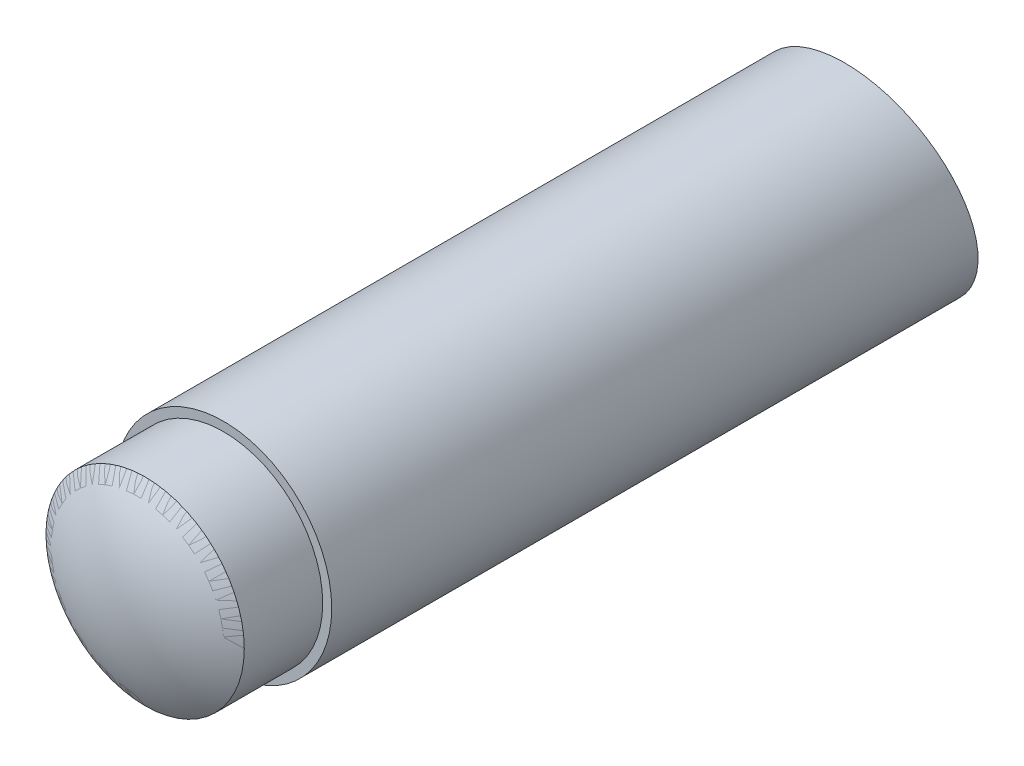
ISO-10303-21;
HEADER;
FILE_DESCRIPTION(('STEP AP214'),'2;1');
FILE_NAME('part.step','',(''),(''),'','','');
FILE_SCHEMA(('AUTOMOTIVE_DESIGN { 1 0 10303 214 1 1 1 1 }'));
ENDSEC;
DATA;
#1=APPLICATION_CONTEXT('core data for automotive mechanical design processes');
#2=APPLICATION_PROTOCOL_DEFINITION('international standard','automotive_design',2000,#1);
#3=PRODUCT_CONTEXT('',#1,'mechanical');
#4=PRODUCT('Part','Part','',(#3));
#5=PRODUCT_RELATED_PRODUCT_CATEGORY('part','',(#4));
#6=PRODUCT_DEFINITION_FORMATION('','',#4);
#7=PRODUCT_DEFINITION_CONTEXT('part definition',#1,'design');
#8=PRODUCT_DEFINITION('design','',#6,#7);
#9=PRODUCT_DEFINITION_SHAPE('','',#8);
#10=(LENGTH_UNIT() NAMED_UNIT(*) SI_UNIT(.MILLI.,.METRE.));
#11=(NAMED_UNIT(*) PLANE_ANGLE_UNIT() SI_UNIT($,.RADIAN.));
#12=(NAMED_UNIT(*) SI_UNIT($,.STERADIAN.) SOLID_ANGLE_UNIT());
#13=UNCERTAINTY_MEASURE_WITH_UNIT(LENGTH_MEASURE(1.E-05),#10,'distance_accuracy_value','');
#14=(GEOMETRIC_REPRESENTATION_CONTEXT(3) GLOBAL_UNCERTAINTY_ASSIGNED_CONTEXT((#13)) GLOBAL_UNIT_ASSIGNED_CONTEXT((#10,
#11,#12)) REPRESENTATION_CONTEXT('',''));
#15=CARTESIAN_POINT('',(0.,0.,0.));
#16=DIRECTION('',(0.,0.,1.));
#17=DIRECTION('',(1.,0.,0.));
#18=AXIS2_PLACEMENT_3D('',#15,#16,#17);
#19=CARTESIAN_POINT('',(0.,0.,33.));
#20=DIRECTION('',(0.,0.,1.));
#21=DIRECTION('',(0.,-1.,0.));
#22=AXIS2_PLACEMENT_3D('',#19,#20,#21);
#23=SPHERICAL_SURFACE('',#22,10.);
#24=CARTESIAN_POINT('',(0.,0.,41.351646544245));
#25=DIRECTION('',(0.,0.,1.));
#26=DIRECTION('',(1.,0.,0.));
#27=AXIS2_PLACEMENT_3D('',#24,#25,#26);
#28=CIRCLE('',#27,5.5);
#29=CARTESIAN_POINT('',(5.5,0.,41.351646544245));
#30=VERTEX_POINT('',#29);
#31=EDGE_CURVE('E12',#30,#30,#28,.T.);
#32=ORIENTED_EDGE('',*,*,#31,.T.);
#33=EDGE_LOOP('',(#32));
#34=FACE_BOUND('',#33,.T.);
#35=ADVANCED_FACE('F52',(#34),#23,.T.);
#36=OPEN_SHELL('',(#35));
#37=SHELL_BASED_SURFACE_MODEL('B2',(#36));
#38=CARTESIAN_POINT('',(0.,0.,43.));
#39=DIRECTION('',(0.,0.,-1.));
#40=DIRECTION('',(-1.,0.,0.));
#41=AXIS2_PLACEMENT_3D('',#38,#39,#40);
#42=CYLINDRICAL_SURFACE('',#41,6.);
#43=DIRECTION('',(0.,0.,-1.));
#44=VECTOR('',#43,1.);
#45=CARTESIAN_POINT('',(-5.45435605731786,2.5,43.));
#46=LINE('',#45,#44);
#47=CARTESIAN_POINT('',(-5.45435605731786,2.5,15.));
#48=VERTEX_POINT('',#47);
#49=CARTESIAN_POINT('',(-5.45435605731786,2.5,23.));
#50=VERTEX_POINT('',#49);
#51=EDGE_CURVE('E50',#48,#50,#46,.F.);
#52=ORIENTED_EDGE('',*,*,#51,.T.);
#53=CARTESIAN_POINT('',(-5.45435605731786,2.5,23.));
#54=CARTESIAN_POINT('',(-5.4543414367274,2.50001024965806,23.066990421397));
#55=CARTESIAN_POINT('',(-5.45558986423115,2.49730766074456,23.1339728576071));
#56=CARTESIAN_POINT('',(-5.46050344433192,2.48655699342007,23.267391217606));
#57=CARTESIAN_POINT('',(-5.46416759753227,2.47851112553775,23.3338273558978));
#58=CARTESIAN_POINT('',(-5.47378318611766,2.45719882557102,23.4654018598714));
#59=CARTESIAN_POINT('',(-5.47972494833872,2.44395446621823,23.5305445048847));
#60=CARTESIAN_POINT('',(-5.49369035165668,2.41239773056354,23.6593476505706));
#61=CARTESIAN_POINT('',(-5.50171413528084,2.39408500729503,23.7230080494492));
#62=CARTESIAN_POINT('',(-5.52852216859036,2.33184505253746,23.9109704766892));
#63=CARTESIAN_POINT('',(-5.55006534458072,2.28056973965756,24.0325349409199));
#64=CARTESIAN_POINT('',(-5.5980502687434,2.16009667726577,24.265394969978));
#65=CARTESIAN_POINT('',(-5.62449711638193,2.09088024017802,24.3766796624162));
#66=CARTESIAN_POINT('',(-5.68111739532849,1.93194216605246,24.5926555180297));
#67=CARTESIAN_POINT('',(-5.71141645652258,1.84129131772596,24.6966314637585));
#68=CARTESIAN_POINT('',(-5.77129106659512,1.6440247325164,24.8884169369691));
#69=CARTESIAN_POINT('',(-5.80086645933831,1.53740558511415,24.9762230019235));
#70=CARTESIAN_POINT('',(-5.85751079611205,1.30552662419109,25.1368988289762));
#71=CARTESIAN_POINT('',(-5.88441492036275,1.17965801419142,25.2089534877025));
#72=CARTESIAN_POINT('',(-5.93113050419022,0.916263349803655,25.3305523948046));
#73=CARTESIAN_POINT('',(-5.95094514533806,0.778742558960748,25.3801067434128));
#74=CARTESIAN_POINT('',(-5.98035028996094,0.503538212911763,25.4526785710471));
#75=CARTESIAN_POINT('',(-5.99041924152298,0.36623563668335,25.4769429460133));
#76=CARTESIAN_POINT('',(-6.00093656296527,0.0891608856613059,25.502275267891));
#77=CARTESIAN_POINT('',(-6.00138866214753,-0.0506103107853714,25.5033522066188));
#78=CARTESIAN_POINT('',(-5.99290254661357,-0.319586702683726,25.4829313516378));
#79=CARTESIAN_POINT('',(-5.98453414521297,-0.448917245472146,25.4628034512649));
#80=CARTESIAN_POINT('',(-5.96013005449445,-0.702167963543973,25.4028930910878));
#81=CARTESIAN_POINT('',(-5.94409393401055,-0.82608783415044,25.3631095260154));
#82=CARTESIAN_POINT('',(-5.90559715444489,-1.06727556823007,25.2645442163381));
#83=CARTESIAN_POINT('',(-5.88304219015531,-1.1844130633202,25.2054818206956));
#84=CARTESIAN_POINT('',(-5.83371457161593,-1.40742238732224,25.0703092180309));
#85=CARTESIAN_POINT('',(-5.80694038196896,-1.51329009151026,24.9941928006955));
#86=CARTESIAN_POINT('',(-5.74963576527152,-1.71867537807254,24.8208409664575));
#87=CARTESIAN_POINT('',(-5.71897359653013,-1.81722082953265,24.7224958287417));
#88=CARTESIAN_POINT('',(-5.65876079183101,-1.99685313522822,24.5105893535751));
#89=CARTESIAN_POINT('',(-5.62921072584973,-2.07793113494236,24.3970203460054));
#90=CARTESIAN_POINT('',(-5.57361619012468,-2.22284514508404,24.1531453498455));
#91=CARTESIAN_POINT('',(-5.54772171984214,-2.28601504206341,24.0224071265261));
#92=CARTESIAN_POINT('',(-5.50417661447929,-2.38897619183128,23.7508546265431));
#93=CARTESIAN_POINT('',(-5.48651080537515,-2.4288105117282,23.6100594530022));
#94=CARTESIAN_POINT('',(-5.46773287951056,-2.47065526537902,23.3898491565922));
#95=CARTESIAN_POINT('',(-5.46274303006064,-2.48164099212926,23.3123689332134));
#96=CARTESIAN_POINT('',(-5.45604541462647,-2.49631631258703,23.1566098186605));
#97=CARTESIAN_POINT('',(-5.45433647659977,-2.50000851178052,23.0783312227393));
#98=CARTESIAN_POINT('',(-5.45435605731786,-2.5,23.));
#99=B_SPLINE_CURVE_WITH_KNOTS('',3,(#53,#54,#55,#56,#57,#58,#59,#60,#61,#62,#63,#64,#65,#66,#67,
#68,#69,#70,#71,#72,#73,#74,#75,#76,#77,#78,#79,#80,#81,#82,#83,#84,#85,#86,#87,#88,#89,#90,#91,
#92,#93,#94,#95,#96,#97,#98),.UNSPECIFIED.,.F.,.F.,(4,2,2,2,2,2,2,2,2,2,2,2,2,2,2,2,2,2,2,2,2,2,
4),(0.,0.200891876435008,0.401700695097973,0.601665948391963,0.801644894158599,1.20075599352941,
1.6002844916061,2.02212344548655,2.44405262481498,2.88432120276327,3.32439195134774,
3.74155898035476,4.15856423395471,4.55019084443641,4.94183947919071,5.33946474085078,
5.73723503589979,6.16301556467703,6.58901142297274,7.02923147484728,7.4686364954648,
7.70350874445824,7.93829707423865),.UNSPECIFIED.);
#100=CARTESIAN_POINT('',(-5.45435605731786,-2.5,23.));
#101=VERTEX_POINT('',#100);
#102=EDGE_CURVE('E82',#50,#101,#99,.T.);
#103=ORIENTED_EDGE('',*,*,#102,.T.);
#104=DIRECTION('',(0.,0.,-1.));
#105=VECTOR('',#104,1.);
#106=CARTESIAN_POINT('',(-5.45435605731786,-2.5,43.));
#107=LINE('',#106,#105);
#108=CARTESIAN_POINT('',(-5.45435605731786,-2.5,15.));
#109=VERTEX_POINT('',#108);
#110=EDGE_CURVE('E154',#101,#109,#107,.T.);
#111=ORIENTED_EDGE('',*,*,#110,.T.);
#112=CARTESIAN_POINT('',(-5.45435605731786,-2.5,15.));
#113=CARTESIAN_POINT('',(-5.4543414367274,-2.50001024965806,14.933009578603));
#114=CARTESIAN_POINT('',(-5.45558986423115,-2.49730766074456,14.8660271423929));
#115=CARTESIAN_POINT('',(-5.46050344433192,-2.48655699342007,14.732608782394));
#116=CARTESIAN_POINT('',(-5.46416759753227,-2.47851112553775,14.6661726441022));
#117=CARTESIAN_POINT('',(-5.47378318611766,-2.45719882557102,14.5345981401286));
#118=CARTESIAN_POINT('',(-5.47972494833872,-2.44395446621823,14.4694554951153));
#119=CARTESIAN_POINT('',(-5.49369035165668,-2.41239773056354,14.3406523494294));
#120=CARTESIAN_POINT('',(-5.50171413528084,-2.39408500729503,14.2769919505508));
#121=CARTESIAN_POINT('',(-5.52852216859036,-2.33184505253746,14.0890295233108));
#122=CARTESIAN_POINT('',(-5.55006534458072,-2.28056973965756,13.9674650590801));
#123=CARTESIAN_POINT('',(-5.5980502687434,-2.16009667726576,13.734605030022));
#124=CARTESIAN_POINT('',(-5.62449711638193,-2.09088024017802,13.6233203375838));
#125=CARTESIAN_POINT('',(-5.68111739532849,-1.93194216605246,13.4073444819703));
#126=CARTESIAN_POINT('',(-5.71141645652258,-1.84129131772596,13.3033685362414));
#127=CARTESIAN_POINT('',(-5.77129106659512,-1.6440247325164,13.1115830630309));
#128=CARTESIAN_POINT('',(-5.80086645933831,-1.53740558511415,13.0237769980765));
#129=CARTESIAN_POINT('',(-5.85751079611205,-1.30552662419109,12.8631011710238));
#130=CARTESIAN_POINT('',(-5.88441492036275,-1.17965801419141,12.7910465122975));
#131=CARTESIAN_POINT('',(-5.93113050419022,-0.916263349803653,12.6694476051954));
#132=CARTESIAN_POINT('',(-5.95094514533806,-0.778742558960746,12.6198932565872));
#133=CARTESIAN_POINT('',(-5.98035028996094,-0.503538212911761,12.5473214289529));
#134=CARTESIAN_POINT('',(-5.99041924152298,-0.366235636683348,12.5230570539867));
#135=CARTESIAN_POINT('',(-6.00093656296527,-0.0891608856613045,12.497724732109));
#136=CARTESIAN_POINT('',(-6.00138866214753,0.0506103107853725,12.4966477933812));
#137=CARTESIAN_POINT('',(-5.99290254661357,0.319586702683727,12.5170686483622));
#138=CARTESIAN_POINT('',(-5.98453414521297,0.448917245472146,12.5371965487351));
#139=CARTESIAN_POINT('',(-5.96013005449445,0.702167963543973,12.5971069089122));
#140=CARTESIAN_POINT('',(-5.94409393401055,0.826087834150441,12.6368904739846));
#141=CARTESIAN_POINT('',(-5.90559715444489,1.06727556823007,12.7354557836619));
#142=CARTESIAN_POINT('',(-5.88304219015531,1.1844130633202,12.7945181793044));
#143=CARTESIAN_POINT('',(-5.83371457161593,1.40742238732224,12.9296907819691));
#144=CARTESIAN_POINT('',(-5.80694038196897,1.51329009151026,13.0058071993045));
#145=CARTESIAN_POINT('',(-5.74963576527152,1.71867537807254,13.1791590335425));
#146=CARTESIAN_POINT('',(-5.71897359653013,1.81722082953265,13.2775041712583));
#147=CARTESIAN_POINT('',(-5.65876079183101,1.99685313522822,13.4894106464249));
#148=CARTESIAN_POINT('',(-5.62921072584973,2.07793113494236,13.6029796539946));
#149=CARTESIAN_POINT('',(-5.57361619012467,2.22284514508405,13.8468546501545));
#150=CARTESIAN_POINT('',(-5.54772171984214,2.28601504206341,13.9775928734739));
#151=CARTESIAN_POINT('',(-5.50417661447929,2.38897619183128,14.2491453734569));
#152=CARTESIAN_POINT('',(-5.48651080537515,2.4288105117282,14.3899405469978));
#153=CARTESIAN_POINT('',(-5.46773287951056,2.47065526537902,14.6101508434078));
#154=CARTESIAN_POINT('',(-5.46274303006064,2.48164099212926,14.6876310667866));
#155=CARTESIAN_POINT('',(-5.45604541462647,2.49631631258703,14.8433901813395));
#156=CARTESIAN_POINT('',(-5.45433647659977,2.50000851178052,14.9216687772607));
#157=CARTESIAN_POINT('',(-5.45435605731786,2.5,15.));
#158=B_SPLINE_CURVE_WITH_KNOTS('',3,(#112,#113,#114,#115,#116,#117,#118,#119,#120,#121,#122,
#123,#124,#125,#126,#127,#128,#129,#130,#131,#132,#133,#134,#135,#136,#137,#138,#139,#140,#141,
#142,#143,#144,#145,#146,#147,#148,#149,#150,#151,#152,#153,#154,#155,#156,#157),.UNSPECIFIED.,
.F.,.F.,(4,2,2,2,2,2,2,2,2,2,2,2,2,2,2,2,2,2,2,2,2,2,4),(0.,0.200891876435008,0.401700695097975,
0.601665948391965,0.801644894158599,1.20075599352942,1.6002844916061,2.02212344548655,
2.44405262481498,2.88432120276328,3.32439195134774,3.74155898035476,4.15856423395471,
4.55019084443641,4.94183947919071,5.33946474085078,5.73723503589979,6.16301556467703,
6.58901142297275,7.02923147484728,7.4686364954648,7.70350874445824,7.93829707423865),.UNSPECIFIED.);
#159=EDGE_CURVE('E75',#109,#48,#158,.T.);
#160=ORIENTED_EDGE('',*,*,#159,.T.);
#161=EDGE_LOOP('',(#52,#103,#111,#160));
#162=FACE_BOUND('',#161,.T.);
#163=CARTESIAN_POINT('',(0.,0.,1.27533937002009));
#164=DIRECTION('',(0.,-0.207911690817753,0.978147600733807));
#165=DIRECTION('',(0.,-0.978147600733807,-0.207911690817753));
#166=AXIS2_PLACEMENT_3D('',#163,#164,#165);
#167=ELLIPSE('',#166,6.13404356919017,6.);
#168=CARTESIAN_POINT('',(0.,-6.,0.));
#169=VERTEX_POINT('',#168);
#170=EDGE_CURVE('E133',#169,#169,#167,.T.);
#171=ORIENTED_EDGE('',*,*,#170,.T.);
#172=EDGE_LOOP('',(#171));
#173=FACE_BOUND('',#172,.T.);
#174=CARTESIAN_POINT('',(0.,0.,37.));
#175=DIRECTION('',(0.,0.,1.));
#176=DIRECTION('',(1.,0.,0.));
#177=AXIS2_PLACEMENT_3D('',#174,#175,#176);
#178=CIRCLE('',#177,6.);
#179=CARTESIAN_POINT('',(6.,0.,37.));
#180=VERTEX_POINT('',#179);
#181=EDGE_CURVE('E143',#180,#180,#178,.T.);
#182=ORIENTED_EDGE('',*,*,#181,.F.);
#183=EDGE_LOOP('',(#182));
#184=FACE_BOUND('',#183,.T.);
#185=ADVANCED_FACE('F67',(#162,#173,#184),#42,.T.);
#186=CARTESIAN_POINT('',(0.,0.,37.));
#187=DIRECTION('',(0.,0.,1.));
#188=DIRECTION('',(1.,0.,0.));
#189=AXIS2_PLACEMENT_3D('',#186,#187,#188);
#190=PLANE('',#189);
#191=CARTESIAN_POINT('',(0.,0.,37.));
#192=DIRECTION('',(0.,0.,1.));
#193=DIRECTION('',(1.,0.,0.));
#194=AXIS2_PLACEMENT_3D('',#191,#192,#193);
#195=CIRCLE('',#194,5.5);
#196=CARTESIAN_POINT('',(5.5,0.,37.));
#197=VERTEX_POINT('',#196);
#198=EDGE_CURVE('E140',#197,#197,#195,.T.);
#199=ORIENTED_EDGE('',*,*,#198,.F.);
#200=EDGE_LOOP('',(#199));
#201=FACE_BOUND('',#200,.T.);
#202=ORIENTED_EDGE('',*,*,#181,.T.);
#203=EDGE_LOOP('',(#202));
#204=FACE_BOUND('',#203,.T.);
#205=ADVANCED_FACE('F183',(#201,#204),#190,.T.);
#206=CARTESIAN_POINT('',(0.,0.,37.));
#207=DIRECTION('',(0.,0.,1.));
#208=DIRECTION('',(1.,0.,0.));
#209=AXIS2_PLACEMENT_3D('',#206,#207,#208);
#210=CYLINDRICAL_SURFACE('',#209,5.5);
#211=ORIENTED_EDGE('',*,*,#198,.T.);
#212=EDGE_LOOP('',(#211));
#213=FACE_BOUND('',#212,.T.);
#214=CARTESIAN_POINT('',(0.,0.,41.351646544245));
#215=DIRECTION('',(0.,0.,-1.));
#216=DIRECTION('',(-1.,0.,0.));
#217=AXIS2_PLACEMENT_3D('',#214,#215,#216);
#218=CIRCLE('',#217,5.5);
#219=CARTESIAN_POINT('',(-5.5,0.,41.351646544245));
#220=VERTEX_POINT('',#219);
#221=EDGE_CURVE('E139',#220,#220,#218,.F.);
#222=ORIENTED_EDGE('',*,*,#221,.F.);
#223=EDGE_LOOP('',(#222));
#224=FACE_BOUND('',#223,.T.);
#225=ADVANCED_FACE('F188',(#213,#224),#210,.T.);
#226=CARTESIAN_POINT('',(0.,0.,33.));
#227=DIRECTION('',(0.,0.,1.));
#228=DIRECTION('',(0.,-1.,0.));
#229=AXIS2_PLACEMENT_3D('',#226,#227,#228);
#230=SPHERICAL_SURFACE('',#229,10.);
#231=ORIENTED_EDGE('',*,*,#221,.T.);
#232=EDGE_LOOP('',(#231));
#233=FACE_BOUND('',#232,.T.);
#234=ADVANCED_FACE('F69',(#233),#230,.T.);
#235=CARTESIAN_POINT('',(65.2846216566311,-6.,0.));
#236=DIRECTION('',(0.,-0.207911690817753,0.978147600733807));
#237=DIRECTION('',(0.,-0.978147600733807,-0.207911690817753));
#238=AXIS2_PLACEMENT_3D('',#235,#236,#237);
#239=PLANE('',#238);
#240=ORIENTED_EDGE('',*,*,#170,.F.);
#241=EDGE_LOOP('',(#240));
#242=FACE_BOUND('',#241,.T.);
#243=ADVANCED_FACE('F169',(#242),#239,.F.);
#244=CARTESIAN_POINT('',(-6.,0.,15.));
#245=DIRECTION('',(1.,0.,0.));
#246=DIRECTION('',(0.,0.,-1.));
#247=AXIS2_PLACEMENT_3D('',#244,#245,#246);
#248=CYLINDRICAL_SURFACE('',#247,2.5);
#249=DIRECTION('',(1.,0.,0.));
#250=VECTOR('',#249,1.);
#251=CARTESIAN_POINT('',(-6.,-2.5,15.));
#252=LINE('',#251,#250);
#253=CARTESIAN_POINT('',(-3.5,-2.5,15.));
#254=VERTEX_POINT('',#253);
#255=EDGE_CURVE('E127',#109,#254,#252,.T.);
#256=ORIENTED_EDGE('',*,*,#255,.T.);
#257=CARTESIAN_POINT('',(-3.5,0.,15.));
#258=DIRECTION('',(1.,0.,0.));
#259=DIRECTION('',(0.,0.,-1.));
#260=AXIS2_PLACEMENT_3D('',#257,#258,#259);
#261=CIRCLE('',#260,2.5);
#262=CARTESIAN_POINT('',(-3.5,2.5,15.));
#263=VERTEX_POINT('',#262);
#264=EDGE_CURVE('E121',#254,#263,#261,.T.);
#265=ORIENTED_EDGE('',*,*,#264,.T.);
#266=DIRECTION('',(1.,0.,0.));
#267=VECTOR('',#266,1.);
#268=CARTESIAN_POINT('',(-6.,2.5,15.));
#269=LINE('',#268,#267);
#270=EDGE_CURVE('E108',#48,#263,#269,.T.);
#271=ORIENTED_EDGE('',*,*,#270,.F.);
#272=ORIENTED_EDGE('',*,*,#159,.F.);
#273=EDGE_LOOP('',(#256,#265,#271,#272));
#274=FACE_BOUND('',#273,.T.);
#275=ADVANCED_FACE('F126',(#274),#248,.F.);
#276=CARTESIAN_POINT('',(-6.,-2.5,15.));
#277=DIRECTION('',(0.,-1.,0.));
#278=DIRECTION('',(0.,0.,-1.));
#279=AXIS2_PLACEMENT_3D('',#276,#277,#278);
#280=PLANE('',#279);
#281=DIRECTION('',(1.,0.,0.));
#282=VECTOR('',#281,1.);
#283=CARTESIAN_POINT('',(-6.,-2.5,23.));
#284=LINE('',#283,#282);
#285=CARTESIAN_POINT('',(-3.5,-2.5,23.));
#286=VERTEX_POINT('',#285);
#287=EDGE_CURVE('E134',#101,#286,#284,.T.);
#288=ORIENTED_EDGE('',*,*,#287,.T.);
#289=DIRECTION('',(0.,0.,-1.));
#290=VECTOR('',#289,1.);
#291=CARTESIAN_POINT('',(-3.5,-2.5,15.));
#292=LINE('',#291,#290);
#293=EDGE_CURVE('E114',#286,#254,#292,.T.);
#294=ORIENTED_EDGE('',*,*,#293,.T.);
#295=ORIENTED_EDGE('',*,*,#255,.F.);
#296=ORIENTED_EDGE('',*,*,#110,.F.);
#297=EDGE_LOOP('',(#288,#294,#295,#296));
#298=FACE_BOUND('',#297,.T.);
#299=ADVANCED_FACE('F162',(#298),#280,.F.);
#300=CARTESIAN_POINT('',(-6.,0.,23.));
#301=DIRECTION('',(1.,0.,0.));
#302=DIRECTION('',(0.,0.,-1.));
#303=AXIS2_PLACEMENT_3D('',#300,#301,#302);
#304=CYLINDRICAL_SURFACE('',#303,2.5);
#305=DIRECTION('',(1.,0.,0.));
#306=VECTOR('',#305,1.);
#307=CARTESIAN_POINT('',(-6.,2.5,23.));
#308=LINE('',#307,#306);
#309=CARTESIAN_POINT('',(-3.5,2.5,23.));
#310=VERTEX_POINT('',#309);
#311=EDGE_CURVE('E113',#50,#310,#308,.T.);
#312=ORIENTED_EDGE('',*,*,#311,.T.);
#313=CARTESIAN_POINT('',(-3.5,0.,23.));
#314=DIRECTION('',(1.,0.,0.));
#315=DIRECTION('',(0.,0.,-1.));
#316=AXIS2_PLACEMENT_3D('',#313,#314,#315);
#317=CIRCLE('',#316,2.5);
#318=EDGE_CURVE('E124',#310,#286,#317,.T.);
#319=ORIENTED_EDGE('',*,*,#318,.T.);
#320=ORIENTED_EDGE('',*,*,#287,.F.);
#321=ORIENTED_EDGE('',*,*,#102,.F.);
#322=EDGE_LOOP('',(#312,#319,#320,#321));
#323=FACE_BOUND('',#322,.T.);
#324=ADVANCED_FACE('F157',(#323),#304,.F.);
#325=CARTESIAN_POINT('',(-6.,2.5,15.));
#326=DIRECTION('',(0.,1.,0.));
#327=DIRECTION('',(0.,0.,1.));
#328=AXIS2_PLACEMENT_3D('',#325,#326,#327);
#329=PLANE('',#328);
#330=ORIENTED_EDGE('',*,*,#270,.T.);
#331=DIRECTION('',(0.,0.,1.));
#332=VECTOR('',#331,1.);
#333=CARTESIAN_POINT('',(-3.5,2.5,15.));
#334=LINE('',#333,#332);
#335=EDGE_CURVE('E111',#263,#310,#334,.T.);
#336=ORIENTED_EDGE('',*,*,#335,.T.);
#337=ORIENTED_EDGE('',*,*,#311,.F.);
#338=ORIENTED_EDGE('',*,*,#51,.F.);
#339=EDGE_LOOP('',(#330,#336,#337,#338));
#340=FACE_BOUND('',#339,.T.);
#341=ADVANCED_FACE('F110',(#340),#329,.F.);
#342=CARTESIAN_POINT('',(-3.5,0.,15.));
#343=DIRECTION('',(1.,0.,0.));
#344=DIRECTION('',(0.,0.,-1.));
#345=AXIS2_PLACEMENT_3D('',#342,#343,#344);
#346=PLANE('',#345);
#347=ORIENTED_EDGE('',*,*,#264,.F.);
#348=ORIENTED_EDGE('',*,*,#293,.F.);
#349=ORIENTED_EDGE('',*,*,#318,.F.);
#350=ORIENTED_EDGE('',*,*,#335,.F.);
#351=EDGE_LOOP('',(#347,#348,#349,#350));
#352=FACE_BOUND('',#351,.T.);
#353=ADVANCED_FACE('F119',(#352),#346,.F.);
#354=CLOSED_SHELL('',(#185,#205,#225,#234,#243,#275,#299,#324,#341,#353));
#355=MANIFOLD_SOLID_BREP('B7',#354);
#356=ADVANCED_BREP_SHAPE_REPRESENTATION('',(#18,#355),#14);
#357=MANIFOLD_SURFACE_SHAPE_REPRESENTATION('',(#18,#37),#14);
#358=SHAPE_REPRESENTATION('',(#18),#14);
#359=SHAPE_DEFINITION_REPRESENTATION(#9,#358);
#360=SHAPE_REPRESENTATION_RELATIONSHIP('','',#358,#356);
#361=SHAPE_REPRESENTATION_RELATIONSHIP('','',#358,#357);
ENDSEC;
END-ISO-10303-21;
